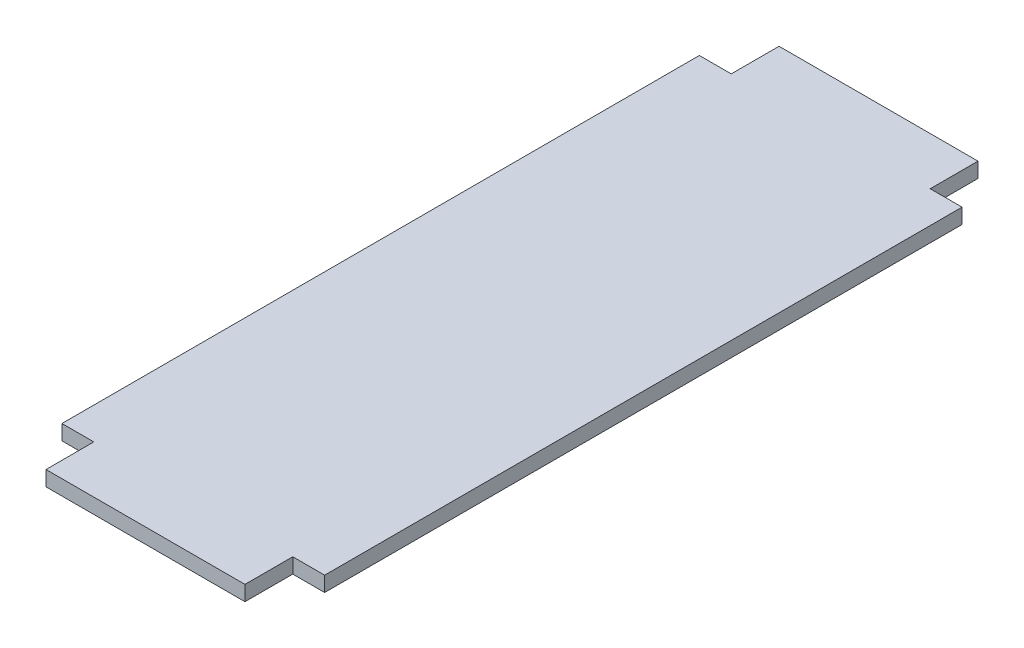
ISO-10303-21;
HEADER;
FILE_DESCRIPTION(('STEP AP214'),'2;1');
FILE_NAME('part.step','',(''),(''),'','','');
FILE_SCHEMA(('AUTOMOTIVE_DESIGN { 1 0 10303 214 1 1 1 1 }'));
ENDSEC;
DATA;
#1=APPLICATION_CONTEXT('core data for automotive mechanical design processes');
#2=APPLICATION_PROTOCOL_DEFINITION('international standard','automotive_design',2000,#1);
#3=PRODUCT_CONTEXT('',#1,'mechanical');
#4=PRODUCT('Part','Part','',(#3));
#5=PRODUCT_RELATED_PRODUCT_CATEGORY('part','',(#4));
#6=PRODUCT_DEFINITION_FORMATION('','',#4);
#7=PRODUCT_DEFINITION_CONTEXT('part definition',#1,'design');
#8=PRODUCT_DEFINITION('design','',#6,#7);
#9=PRODUCT_DEFINITION_SHAPE('','',#8);
#10=(LENGTH_UNIT() NAMED_UNIT(*) SI_UNIT(.MILLI.,.METRE.));
#11=(NAMED_UNIT(*) PLANE_ANGLE_UNIT() SI_UNIT($,.RADIAN.));
#12=(NAMED_UNIT(*) SI_UNIT($,.STERADIAN.) SOLID_ANGLE_UNIT());
#13=UNCERTAINTY_MEASURE_WITH_UNIT(LENGTH_MEASURE(1.E-05),#10,'distance_accuracy_value','');
#14=(GEOMETRIC_REPRESENTATION_CONTEXT(3) GLOBAL_UNCERTAINTY_ASSIGNED_CONTEXT((#13)) GLOBAL_UNIT_ASSIGNED_CONTEXT((#10,
#11,#12)) REPRESENTATION_CONTEXT('',''));
#15=CARTESIAN_POINT('',(0.,0.,0.));
#16=DIRECTION('',(0.,0.,1.));
#17=DIRECTION('',(1.,0.,0.));
#18=AXIS2_PLACEMENT_3D('',#15,#16,#17);
#19=CARTESIAN_POINT('',(0.,2.9972,73.025));
#20=DIRECTION('',(0.,0.,1.));
#21=DIRECTION('',(1.,0.,0.));
#22=AXIS2_PLACEMENT_3D('',#19,#20,#21);
#23=PLANE('',#22);
#24=DIRECTION('',(-1.,0.,0.));
#25=VECTOR('',#24,1.);
#26=CARTESIAN_POINT('',(0.,0.,73.025));
#27=LINE('',#26,#25);
#28=CARTESIAN_POINT('',(19.8190231000001,0.,73.025));
#29=VERTEX_POINT('',#28);
#30=CARTESIAN_POINT('',(-19.8190230999999,0.,73.025));
#31=VERTEX_POINT('',#30);
#32=EDGE_CURVE('E164',#29,#31,#27,.T.);
#33=ORIENTED_EDGE('',*,*,#32,.F.);
#34=DIRECTION('',(0.,-1.,0.));
#35=VECTOR('',#34,1.);
#36=CARTESIAN_POINT('',(19.8190231000001,2.9972,73.025));
#37=LINE('',#36,#35);
#38=CARTESIAN_POINT('',(19.8190231000001,2.9972,73.025));
#39=VERTEX_POINT('',#38);
#40=EDGE_CURVE('E11',#39,#29,#37,.T.);
#41=ORIENTED_EDGE('',*,*,#40,.F.);
#42=DIRECTION('',(-1.,0.,0.));
#43=VECTOR('',#42,1.);
#44=CARTESIAN_POINT('',(0.,2.9972,73.025));
#45=LINE('',#44,#43);
#46=CARTESIAN_POINT('',(-19.8190230999999,2.9972,73.025));
#47=VERTEX_POINT('',#46);
#48=EDGE_CURVE('E206',#39,#47,#45,.T.);
#49=ORIENTED_EDGE('',*,*,#48,.T.);
#50=DIRECTION('',(0.,-1.,0.));
#51=VECTOR('',#50,1.);
#52=CARTESIAN_POINT('',(-19.8190230999999,2.9972,73.025));
#53=LINE('',#52,#51);
#54=EDGE_CURVE('E56',#47,#31,#53,.T.);
#55=ORIENTED_EDGE('',*,*,#54,.T.);
#56=EDGE_LOOP('',(#33,#41,#49,#55));
#57=FACE_BOUND('',#56,.T.);
#58=ADVANCED_FACE('F39',(#57),#23,.T.);
#59=CARTESIAN_POINT('',(19.8190231000001,2.9972,0.));
#60=DIRECTION('',(-1.,0.,0.));
#61=DIRECTION('',(0.,0.,1.));
#62=AXIS2_PLACEMENT_3D('',#59,#60,#61);
#63=PLANE('',#62);
#64=DIRECTION('',(0.,0.,-1.));
#65=VECTOR('',#64,1.);
#66=CARTESIAN_POINT('',(19.8190231000001,0.,0.));
#67=LINE('',#66,#65);
#68=CARTESIAN_POINT('',(19.8190231000001,0.,63.5));
#69=VERTEX_POINT('',#68);
#70=EDGE_CURVE('E167',#29,#69,#67,.T.);
#71=ORIENTED_EDGE('',*,*,#70,.T.);
#72=DIRECTION('',(0.,-1.,0.));
#73=VECTOR('',#72,1.);
#74=CARTESIAN_POINT('',(19.8190231000001,2.9972,63.5));
#75=LINE('',#74,#73);
#76=CARTESIAN_POINT('',(19.8190231000001,2.9972,63.5));
#77=VERTEX_POINT('',#76);
#78=EDGE_CURVE('E48',#77,#69,#75,.T.);
#79=ORIENTED_EDGE('',*,*,#78,.F.);
#80=DIRECTION('',(0.,0.,-1.));
#81=VECTOR('',#80,1.);
#82=CARTESIAN_POINT('',(19.8190231000001,2.9972,0.));
#83=LINE('',#82,#81);
#84=EDGE_CURVE('E400',#39,#77,#83,.T.);
#85=ORIENTED_EDGE('',*,*,#84,.F.);
#86=ORIENTED_EDGE('',*,*,#40,.T.);
#87=EDGE_LOOP('',(#71,#79,#85,#86));
#88=FACE_BOUND('',#87,.T.);
#89=ADVANCED_FACE('F242',(#88),#63,.F.);
#90=CARTESIAN_POINT('',(0.,2.9972,63.5));
#91=DIRECTION('',(0.,0.,1.));
#92=DIRECTION('',(1.,0.,0.));
#93=AXIS2_PLACEMENT_3D('',#90,#91,#92);
#94=PLANE('',#93);
#95=DIRECTION('',(-1.,0.,0.));
#96=VECTOR('',#95,1.);
#97=CARTESIAN_POINT('',(0.,0.,63.5));
#98=LINE('',#97,#96);
#99=CARTESIAN_POINT('',(26.1690231000001,0.,63.5));
#100=VERTEX_POINT('',#99);
#101=EDGE_CURVE('E171',#100,#69,#98,.T.);
#102=ORIENTED_EDGE('',*,*,#101,.F.);
#103=DIRECTION('',(0.,-1.,0.));
#104=VECTOR('',#103,1.);
#105=CARTESIAN_POINT('',(26.1690231000001,2.9972,63.5));
#106=LINE('',#105,#104);
#107=CARTESIAN_POINT('',(26.1690231000001,2.9972,63.5));
#108=VERTEX_POINT('',#107);
#109=EDGE_CURVE('E230',#108,#100,#106,.T.);
#110=ORIENTED_EDGE('',*,*,#109,.F.);
#111=DIRECTION('',(-1.,0.,0.));
#112=VECTOR('',#111,1.);
#113=CARTESIAN_POINT('',(0.,2.9972,63.5));
#114=LINE('',#113,#112);
#115=EDGE_CURVE('E239',#108,#77,#114,.T.);
#116=ORIENTED_EDGE('',*,*,#115,.T.);
#117=ORIENTED_EDGE('',*,*,#78,.T.);
#118=EDGE_LOOP('',(#102,#110,#116,#117));
#119=FACE_BOUND('',#118,.T.);
#120=ADVANCED_FACE('F237',(#119),#94,.T.);
#121=CARTESIAN_POINT('',(26.1690231000001,2.9972,0.));
#122=DIRECTION('',(-1.,0.,0.));
#123=DIRECTION('',(0.,0.,1.));
#124=AXIS2_PLACEMENT_3D('',#121,#122,#123);
#125=PLANE('',#124);
#126=DIRECTION('',(0.,0.,-1.));
#127=VECTOR('',#126,1.);
#128=CARTESIAN_POINT('',(26.1690231000001,0.,0.));
#129=LINE('',#128,#127);
#130=CARTESIAN_POINT('',(26.1690231000001,0.,-63.5));
#131=VERTEX_POINT('',#130);
#132=EDGE_CURVE('E175',#100,#131,#129,.T.);
#133=ORIENTED_EDGE('',*,*,#132,.T.);
#134=DIRECTION('',(0.,-1.,0.));
#135=VECTOR('',#134,1.);
#136=CARTESIAN_POINT('',(26.1690231000001,2.9972,-63.5));
#137=LINE('',#136,#135);
#138=CARTESIAN_POINT('',(26.1690231000001,2.9972,-63.5));
#139=VERTEX_POINT('',#138);
#140=EDGE_CURVE('E226',#139,#131,#137,.T.);
#141=ORIENTED_EDGE('',*,*,#140,.F.);
#142=DIRECTION('',(0.,0.,-1.));
#143=VECTOR('',#142,1.);
#144=CARTESIAN_POINT('',(26.1690231000001,2.9972,0.));
#145=LINE('',#144,#143);
#146=EDGE_CURVE('E260',#108,#139,#145,.T.);
#147=ORIENTED_EDGE('',*,*,#146,.F.);
#148=ORIENTED_EDGE('',*,*,#109,.T.);
#149=EDGE_LOOP('',(#133,#141,#147,#148));
#150=FACE_BOUND('',#149,.T.);
#151=ADVANCED_FACE('F249',(#150),#125,.F.);
#152=CARTESIAN_POINT('',(0.,2.9972,-63.5));
#153=DIRECTION('',(0.,0.,1.));
#154=DIRECTION('',(1.,0.,0.));
#155=AXIS2_PLACEMENT_3D('',#152,#153,#154);
#156=PLANE('',#155);
#157=DIRECTION('',(-1.,0.,0.));
#158=VECTOR('',#157,1.);
#159=CARTESIAN_POINT('',(0.,0.,-63.5));
#160=LINE('',#159,#158);
#161=CARTESIAN_POINT('',(19.8190231000001,0.,-63.5));
#162=VERTEX_POINT('',#161);
#163=EDGE_CURVE('E178',#131,#162,#160,.T.);
#164=ORIENTED_EDGE('',*,*,#163,.T.);
#165=DIRECTION('',(0.,-1.,0.));
#166=VECTOR('',#165,1.);
#167=CARTESIAN_POINT('',(19.8190231000001,2.9972,-63.5));
#168=LINE('',#167,#166);
#169=CARTESIAN_POINT('',(19.8190231000001,2.9972,-63.5));
#170=VERTEX_POINT('',#169);
#171=EDGE_CURVE('E223',#170,#162,#168,.T.);
#172=ORIENTED_EDGE('',*,*,#171,.F.);
#173=DIRECTION('',(-1.,0.,0.));
#174=VECTOR('',#173,1.);
#175=CARTESIAN_POINT('',(0.,2.9972,-63.5));
#176=LINE('',#175,#174);
#177=EDGE_CURVE('E255',#139,#170,#176,.T.);
#178=ORIENTED_EDGE('',*,*,#177,.F.);
#179=ORIENTED_EDGE('',*,*,#140,.T.);
#180=EDGE_LOOP('',(#164,#172,#178,#179));
#181=FACE_BOUND('',#180,.T.);
#182=ADVANCED_FACE('F253',(#181),#156,.F.);
#183=CARTESIAN_POINT('',(19.8190231000001,2.9972,0.));
#184=DIRECTION('',(1.,0.,0.));
#185=DIRECTION('',(0.,0.,-1.));
#186=AXIS2_PLACEMENT_3D('',#183,#184,#185);
#187=PLANE('',#186);
#188=DIRECTION('',(0.,0.,1.));
#189=VECTOR('',#188,1.);
#190=CARTESIAN_POINT('',(19.8190231000001,0.,0.));
#191=LINE('',#190,#189);
#192=CARTESIAN_POINT('',(19.8190231000001,0.,-73.025));
#193=VERTEX_POINT('',#192);
#194=EDGE_CURVE('E182',#193,#162,#191,.T.);
#195=ORIENTED_EDGE('',*,*,#194,.F.);
#196=DIRECTION('',(0.,-1.,0.));
#197=VECTOR('',#196,1.);
#198=CARTESIAN_POINT('',(19.8190231000001,2.9972,-73.025));
#199=LINE('',#198,#197);
#200=CARTESIAN_POINT('',(19.8190231000001,2.9972,-73.025));
#201=VERTEX_POINT('',#200);
#202=EDGE_CURVE('E220',#201,#193,#199,.T.);
#203=ORIENTED_EDGE('',*,*,#202,.F.);
#204=DIRECTION('',(0.,0.,1.));
#205=VECTOR('',#204,1.);
#206=CARTESIAN_POINT('',(19.8190231000001,2.9972,0.));
#207=LINE('',#206,#205);
#208=EDGE_CURVE('E259',#201,#170,#207,.T.);
#209=ORIENTED_EDGE('',*,*,#208,.T.);
#210=ORIENTED_EDGE('',*,*,#171,.T.);
#211=EDGE_LOOP('',(#195,#203,#209,#210));
#212=FACE_BOUND('',#211,.T.);
#213=ADVANCED_FACE('F304',(#212),#187,.T.);
#214=CARTESIAN_POINT('',(0.,2.9972,-73.025));
#215=DIRECTION('',(0.,0.,1.));
#216=DIRECTION('',(1.,0.,0.));
#217=AXIS2_PLACEMENT_3D('',#214,#215,#216);
#218=PLANE('',#217);
#219=DIRECTION('',(-1.,0.,0.));
#220=VECTOR('',#219,1.);
#221=CARTESIAN_POINT('',(0.,0.,-73.025));
#222=LINE('',#221,#220);
#223=CARTESIAN_POINT('',(-19.8190230999999,0.,-73.025));
#224=VERTEX_POINT('',#223);
#225=EDGE_CURVE('E186',#193,#224,#222,.T.);
#226=ORIENTED_EDGE('',*,*,#225,.T.);
#227=DIRECTION('',(0.,-1.,0.));
#228=VECTOR('',#227,1.);
#229=CARTESIAN_POINT('',(-19.8190230999999,2.9972,-73.025));
#230=LINE('',#229,#228);
#231=CARTESIAN_POINT('',(-19.8190230999999,2.9972,-73.025));
#232=VERTEX_POINT('',#231);
#233=EDGE_CURVE('E216',#232,#224,#230,.T.);
#234=ORIENTED_EDGE('',*,*,#233,.F.);
#235=DIRECTION('',(-1.,0.,0.));
#236=VECTOR('',#235,1.);
#237=CARTESIAN_POINT('',(0.,2.9972,-73.025));
#238=LINE('',#237,#236);
#239=EDGE_CURVE('E264',#201,#232,#238,.T.);
#240=ORIENTED_EDGE('',*,*,#239,.F.);
#241=ORIENTED_EDGE('',*,*,#202,.T.);
#242=EDGE_LOOP('',(#226,#234,#240,#241));
#243=FACE_BOUND('',#242,.T.);
#244=ADVANCED_FACE('F307',(#243),#218,.F.);
#245=CARTESIAN_POINT('',(-19.8190230999999,2.9972,0.));
#246=DIRECTION('',(1.,0.,0.));
#247=DIRECTION('',(0.,0.,-1.));
#248=AXIS2_PLACEMENT_3D('',#245,#246,#247);
#249=PLANE('',#248);
#250=DIRECTION('',(0.,0.,1.));
#251=VECTOR('',#250,1.);
#252=CARTESIAN_POINT('',(-19.8190230999999,0.,0.));
#253=LINE('',#252,#251);
#254=CARTESIAN_POINT('',(-19.8190230999999,0.,-63.5));
#255=VERTEX_POINT('',#254);
#256=EDGE_CURVE('E189',#224,#255,#253,.T.);
#257=ORIENTED_EDGE('',*,*,#256,.T.);
#258=DIRECTION('',(0.,-1.,0.));
#259=VECTOR('',#258,1.);
#260=CARTESIAN_POINT('',(-19.8190230999999,2.9972,-63.5));
#261=LINE('',#260,#259);
#262=CARTESIAN_POINT('',(-19.8190230999999,2.9972,-63.5));
#263=VERTEX_POINT('',#262);
#264=EDGE_CURVE('E213',#263,#255,#261,.T.);
#265=ORIENTED_EDGE('',*,*,#264,.F.);
#266=DIRECTION('',(0.,0.,1.));
#267=VECTOR('',#266,1.);
#268=CARTESIAN_POINT('',(-19.8190230999999,2.9972,0.));
#269=LINE('',#268,#267);
#270=EDGE_CURVE('E158',#232,#263,#269,.T.);
#271=ORIENTED_EDGE('',*,*,#270,.F.);
#272=ORIENTED_EDGE('',*,*,#233,.T.);
#273=EDGE_LOOP('',(#257,#265,#271,#272));
#274=FACE_BOUND('',#273,.T.);
#275=ADVANCED_FACE('F276',(#274),#249,.F.);
#276=CARTESIAN_POINT('',(1.38777878078145E-13,2.9972,-63.5));
#277=DIRECTION('',(0.,0.,-1.));
#278=DIRECTION('',(-1.,0.,0.));
#279=AXIS2_PLACEMENT_3D('',#276,#277,#278);
#280=PLANE('',#279);
#281=DIRECTION('',(1.,0.,0.));
#282=VECTOR('',#281,1.);
#283=CARTESIAN_POINT('',(1.38777878078145E-13,0.,-63.5));
#284=LINE('',#283,#282);
#285=CARTESIAN_POINT('',(-26.1690230999999,0.,-63.5));
#286=VERTEX_POINT('',#285);
#287=EDGE_CURVE('E193',#286,#255,#284,.T.);
#288=ORIENTED_EDGE('',*,*,#287,.F.);
#289=DIRECTION('',(0.,-1.,0.));
#290=VECTOR('',#289,1.);
#291=CARTESIAN_POINT('',(-26.1690230999999,2.9972,-63.5));
#292=LINE('',#291,#290);
#293=CARTESIAN_POINT('',(-26.1690230999999,2.9972,-63.5));
#294=VERTEX_POINT('',#293);
#295=EDGE_CURVE('E141',#294,#286,#292,.T.);
#296=ORIENTED_EDGE('',*,*,#295,.F.);
#297=DIRECTION('',(1.,0.,0.));
#298=VECTOR('',#297,1.);
#299=CARTESIAN_POINT('',(1.38777878078145E-13,2.9972,-63.5));
#300=LINE('',#299,#298);
#301=EDGE_CURVE('E154',#294,#263,#300,.T.);
#302=ORIENTED_EDGE('',*,*,#301,.T.);
#303=ORIENTED_EDGE('',*,*,#264,.T.);
#304=EDGE_LOOP('',(#288,#296,#302,#303));
#305=FACE_BOUND('',#304,.T.);
#306=ADVANCED_FACE('F280',(#305),#280,.T.);
#307=CARTESIAN_POINT('',(-26.1690230999999,2.9972,0.));
#308=DIRECTION('',(-1.,0.,0.));
#309=DIRECTION('',(0.,0.,1.));
#310=AXIS2_PLACEMENT_3D('',#307,#308,#309);
#311=PLANE('',#310);
#312=DIRECTION('',(0.,0.,-1.));
#313=VECTOR('',#312,1.);
#314=CARTESIAN_POINT('',(-26.1690230999999,0.,0.));
#315=LINE('',#314,#313);
#316=CARTESIAN_POINT('',(-26.1690230999999,0.,63.5));
#317=VERTEX_POINT('',#316);
#318=EDGE_CURVE('E137',#317,#286,#315,.T.);
#319=ORIENTED_EDGE('',*,*,#318,.F.);
#320=DIRECTION('',(0.,-1.,0.));
#321=VECTOR('',#320,1.);
#322=CARTESIAN_POINT('',(-26.1690230999999,2.9972,63.5));
#323=LINE('',#322,#321);
#324=CARTESIAN_POINT('',(-26.1690230999999,2.9972,63.5));
#325=VERTEX_POINT('',#324);
#326=EDGE_CURVE('E131',#325,#317,#323,.T.);
#327=ORIENTED_EDGE('',*,*,#326,.F.);
#328=DIRECTION('',(0.,0.,-1.));
#329=VECTOR('',#328,1.);
#330=CARTESIAN_POINT('',(-26.1690230999999,2.9972,0.));
#331=LINE('',#330,#329);
#332=EDGE_CURVE('E135',#325,#294,#331,.T.);
#333=ORIENTED_EDGE('',*,*,#332,.T.);
#334=ORIENTED_EDGE('',*,*,#295,.T.);
#335=EDGE_LOOP('',(#319,#327,#333,#334));
#336=FACE_BOUND('',#335,.T.);
#337=ADVANCED_FACE('F133',(#336),#311,.T.);
#338=CARTESIAN_POINT('',(1.38777878078145E-13,2.9972,63.5));
#339=DIRECTION('',(0.,0.,-1.));
#340=DIRECTION('',(-1.,0.,0.));
#341=AXIS2_PLACEMENT_3D('',#338,#339,#340);
#342=PLANE('',#341);
#343=DIRECTION('',(1.,0.,0.));
#344=VECTOR('',#343,1.);
#345=CARTESIAN_POINT('',(1.38777878078145E-13,0.,63.5));
#346=LINE('',#345,#344);
#347=CARTESIAN_POINT('',(-19.8190230999999,0.,63.5));
#348=VERTEX_POINT('',#347);
#349=EDGE_CURVE('E199',#317,#348,#346,.T.);
#350=ORIENTED_EDGE('',*,*,#349,.T.);
#351=DIRECTION('',(0.,-1.,0.));
#352=VECTOR('',#351,1.);
#353=CARTESIAN_POINT('',(-19.8190230999999,2.9972,63.5));
#354=LINE('',#353,#352);
#355=CARTESIAN_POINT('',(-19.8190230999999,2.9972,63.5));
#356=VERTEX_POINT('',#355);
#357=EDGE_CURVE('E94',#356,#348,#354,.T.);
#358=ORIENTED_EDGE('',*,*,#357,.F.);
#359=DIRECTION('',(1.,0.,0.));
#360=VECTOR('',#359,1.);
#361=CARTESIAN_POINT('',(1.38777878078145E-13,2.9972,63.5));
#362=LINE('',#361,#360);
#363=EDGE_CURVE('E143',#325,#356,#362,.T.);
#364=ORIENTED_EDGE('',*,*,#363,.F.);
#365=ORIENTED_EDGE('',*,*,#326,.T.);
#366=EDGE_LOOP('',(#350,#358,#364,#365));
#367=FACE_BOUND('',#366,.T.);
#368=ADVANCED_FACE('F144',(#367),#342,.F.);
#369=CARTESIAN_POINT('',(-19.8190230999999,2.9972,0.));
#370=DIRECTION('',(-1.,0.,0.));
#371=DIRECTION('',(0.,0.,1.));
#372=AXIS2_PLACEMENT_3D('',#369,#370,#371);
#373=PLANE('',#372);
#374=DIRECTION('',(0.,0.,-1.));
#375=VECTOR('',#374,1.);
#376=CARTESIAN_POINT('',(-19.8190230999999,0.,0.));
#377=LINE('',#376,#375);
#378=EDGE_CURVE('E202',#31,#348,#377,.T.);
#379=ORIENTED_EDGE('',*,*,#378,.F.);
#380=ORIENTED_EDGE('',*,*,#54,.F.);
#381=DIRECTION('',(0.,0.,-1.));
#382=VECTOR('',#381,1.);
#383=CARTESIAN_POINT('',(-19.8190230999999,2.9972,0.));
#384=LINE('',#383,#382);
#385=EDGE_CURVE('E148',#47,#356,#384,.T.);
#386=ORIENTED_EDGE('',*,*,#385,.T.);
#387=ORIENTED_EDGE('',*,*,#357,.T.);
#388=EDGE_LOOP('',(#379,#380,#386,#387));
#389=FACE_BOUND('',#388,.T.);
#390=ADVANCED_FACE('F281',(#389),#373,.T.);
#391=CARTESIAN_POINT('',(0.,2.9972,0.));
#392=DIRECTION('',(0.,1.,0.));
#393=DIRECTION('',(0.,0.,1.));
#394=AXIS2_PLACEMENT_3D('',#391,#392,#393);
#395=PLANE('',#394);
#396=ORIENTED_EDGE('',*,*,#48,.F.);
#397=ORIENTED_EDGE('',*,*,#84,.T.);
#398=ORIENTED_EDGE('',*,*,#115,.F.);
#399=ORIENTED_EDGE('',*,*,#146,.T.);
#400=ORIENTED_EDGE('',*,*,#177,.T.);
#401=ORIENTED_EDGE('',*,*,#208,.F.);
#402=ORIENTED_EDGE('',*,*,#239,.T.);
#403=ORIENTED_EDGE('',*,*,#270,.T.);
#404=ORIENTED_EDGE('',*,*,#301,.F.);
#405=ORIENTED_EDGE('',*,*,#332,.F.);
#406=ORIENTED_EDGE('',*,*,#363,.T.);
#407=ORIENTED_EDGE('',*,*,#385,.F.);
#408=EDGE_LOOP('',(#396,#397,#398,#399,#400,#401,#402,#403,#404,#405,#406,#407));
#409=FACE_BOUND('',#408,.T.);
#410=ADVANCED_FACE('F152',(#409),#395,.T.);
#411=CARTESIAN_POINT('',(0.,0.,0.));
#412=DIRECTION('',(0.,1.,0.));
#413=DIRECTION('',(0.,0.,1.));
#414=AXIS2_PLACEMENT_3D('',#411,#412,#413);
#415=PLANE('',#414);
#416=ORIENTED_EDGE('',*,*,#32,.T.);
#417=ORIENTED_EDGE('',*,*,#378,.T.);
#418=ORIENTED_EDGE('',*,*,#349,.F.);
#419=ORIENTED_EDGE('',*,*,#318,.T.);
#420=ORIENTED_EDGE('',*,*,#287,.T.);
#421=ORIENTED_EDGE('',*,*,#256,.F.);
#422=ORIENTED_EDGE('',*,*,#225,.F.);
#423=ORIENTED_EDGE('',*,*,#194,.T.);
#424=ORIENTED_EDGE('',*,*,#163,.F.);
#425=ORIENTED_EDGE('',*,*,#132,.F.);
#426=ORIENTED_EDGE('',*,*,#101,.T.);
#427=ORIENTED_EDGE('',*,*,#70,.F.);
#428=EDGE_LOOP('',(#416,#417,#418,#419,#420,#421,#422,#423,#424,#425,#426,#427));
#429=FACE_BOUND('',#428,.T.);
#430=ADVANCED_FACE('F245',(#429),#415,.F.);
#431=CLOSED_SHELL('',(#58,#89,#120,#151,#182,#213,#244,#275,#306,#337,#368,#390,#410,#430));
#432=MANIFOLD_SOLID_BREP('B2',#431);
#433=ADVANCED_BREP_SHAPE_REPRESENTATION('',(#18,#432),#14);
#434=SHAPE_DEFINITION_REPRESENTATION(#9,#433);
ENDSEC;
END-ISO-10303-21;
